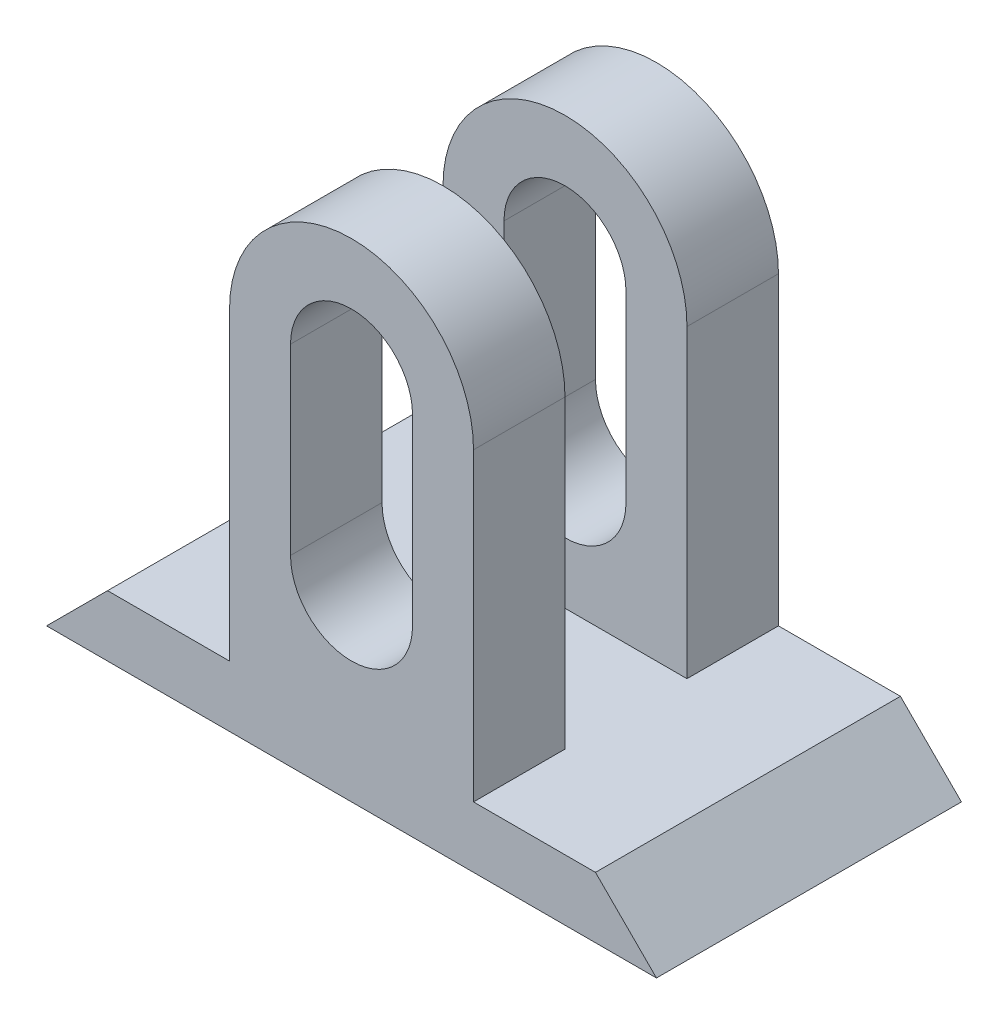
ISO-10303-21;
HEADER;
FILE_DESCRIPTION(('STEP AP214'),'2;1');
FILE_NAME('part.step','',(''),(''),'','','');
FILE_SCHEMA(('AUTOMOTIVE_DESIGN { 1 0 10303 214 1 1 1 1 }'));
ENDSEC;
DATA;
#1=APPLICATION_CONTEXT('core data for automotive mechanical design processes');
#2=APPLICATION_PROTOCOL_DEFINITION('international standard','automotive_design',2000,#1);
#3=PRODUCT_CONTEXT('',#1,'mechanical');
#4=PRODUCT('Part','Part','',(#3));
#5=PRODUCT_RELATED_PRODUCT_CATEGORY('part','',(#4));
#6=PRODUCT_DEFINITION_FORMATION('','',#4);
#7=PRODUCT_DEFINITION_CONTEXT('part definition',#1,'design');
#8=PRODUCT_DEFINITION('design','',#6,#7);
#9=PRODUCT_DEFINITION_SHAPE('','',#8);
#10=(LENGTH_UNIT() NAMED_UNIT(*) SI_UNIT(.MILLI.,.METRE.));
#11=(NAMED_UNIT(*) PLANE_ANGLE_UNIT() SI_UNIT($,.RADIAN.));
#12=(NAMED_UNIT(*) SI_UNIT($,.STERADIAN.) SOLID_ANGLE_UNIT());
#13=UNCERTAINTY_MEASURE_WITH_UNIT(LENGTH_MEASURE(1.E-05),#10,'distance_accuracy_value','');
#14=(GEOMETRIC_REPRESENTATION_CONTEXT(3) GLOBAL_UNCERTAINTY_ASSIGNED_CONTEXT((#13)) GLOBAL_UNIT_ASSIGNED_CONTEXT((#10,
#11,#12)) REPRESENTATION_CONTEXT('',''));
#15=CARTESIAN_POINT('',(0.,0.,0.));
#16=DIRECTION('',(0.,0.,1.));
#17=DIRECTION('',(1.,0.,0.));
#18=AXIS2_PLACEMENT_3D('',#15,#16,#17);
#19=CARTESIAN_POINT('',(0.,9.99999999999999,50.));
#20=DIRECTION('',(0.,1.,0.));
#21=DIRECTION('',(-1.,0.,0.));
#22=AXIS2_PLACEMENT_3D('',#19,#20,#21);
#23=PLANE('',#22);
#24=DIRECTION('',(1.,0.,0.));
#25=VECTOR('',#24,1.);
#26=CARTESIAN_POINT('',(0.,9.99999999999999,50.));
#27=LINE('',#26,#25);
#28=CARTESIAN_POINT('',(10.,10.,50.));
#29=VERTEX_POINT('',#28);
#30=CARTESIAN_POINT('',(30.,10.,50.));
#31=VERTEX_POINT('',#30);
#32=EDGE_CURVE('E324',#29,#31,#27,.T.);
#33=ORIENTED_EDGE('',*,*,#32,.T.);
#34=DIRECTION('',(0.,0.,1.));
#35=VECTOR('',#34,1.);
#36=CARTESIAN_POINT('',(30.,10.,35.));
#37=LINE('',#36,#35);
#38=CARTESIAN_POINT('',(30.,10.,35.));
#39=VERTEX_POINT('',#38);
#40=EDGE_CURVE('E82',#39,#31,#37,.T.);
#41=ORIENTED_EDGE('',*,*,#40,.F.);
#42=DIRECTION('',(-1.,0.,0.));
#43=VECTOR('',#42,1.);
#44=CARTESIAN_POINT('',(0.,9.99999999999999,35.));
#45=LINE('',#44,#43);
#46=CARTESIAN_POINT('',(70.,10.,35.));
#47=VERTEX_POINT('',#46);
#48=EDGE_CURVE('E77',#47,#39,#45,.T.);
#49=ORIENTED_EDGE('',*,*,#48,.F.);
#50=DIRECTION('',(0.,0.,1.));
#51=VECTOR('',#50,1.);
#52=CARTESIAN_POINT('',(70.,10.,35.));
#53=LINE('',#52,#51);
#54=CARTESIAN_POINT('',(70.,10.,50.));
#55=VERTEX_POINT('',#54);
#56=EDGE_CURVE('E251',#47,#55,#53,.T.);
#57=ORIENTED_EDGE('',*,*,#56,.T.);
#58=CARTESIAN_POINT('',(90.,9.99999999999999,50.));
#59=VERTEX_POINT('',#58);
#60=EDGE_CURVE('E327',#55,#59,#27,.T.);
#61=ORIENTED_EDGE('',*,*,#60,.T.);
#62=DIRECTION('',(0.,0.,-1.));
#63=VECTOR('',#62,1.);
#64=CARTESIAN_POINT('',(90.,9.99999999999999,50.));
#65=LINE('',#64,#63);
#66=CARTESIAN_POINT('',(90.,9.99999999999999,0.));
#67=VERTEX_POINT('',#66);
#68=EDGE_CURVE('E334',#59,#67,#65,.T.);
#69=ORIENTED_EDGE('',*,*,#68,.T.);
#70=DIRECTION('',(1.,0.,0.));
#71=VECTOR('',#70,1.);
#72=CARTESIAN_POINT('',(0.,9.99999999999999,0.));
#73=LINE('',#72,#71);
#74=CARTESIAN_POINT('',(70.,10.,0.));
#75=VERTEX_POINT('',#74);
#76=EDGE_CURVE('E317',#75,#67,#73,.T.);
#77=ORIENTED_EDGE('',*,*,#76,.F.);
#78=DIRECTION('',(0.,0.,-1.));
#79=VECTOR('',#78,1.);
#80=CARTESIAN_POINT('',(70.,10.,15.));
#81=LINE('',#80,#79);
#82=CARTESIAN_POINT('',(70.,10.,15.));
#83=VERTEX_POINT('',#82);
#84=EDGE_CURVE('E305',#83,#75,#81,.T.);
#85=ORIENTED_EDGE('',*,*,#84,.F.);
#86=DIRECTION('',(1.,0.,0.));
#87=VECTOR('',#86,1.);
#88=CARTESIAN_POINT('',(0.,9.99999999999999,15.));
#89=LINE('',#88,#87);
#90=CARTESIAN_POINT('',(30.,10.,15.));
#91=VERTEX_POINT('',#90);
#92=EDGE_CURVE('E285',#91,#83,#89,.T.);
#93=ORIENTED_EDGE('',*,*,#92,.F.);
#94=DIRECTION('',(0.,0.,-1.));
#95=VECTOR('',#94,1.);
#96=CARTESIAN_POINT('',(30.,10.,15.));
#97=LINE('',#96,#95);
#98=CARTESIAN_POINT('',(30.,10.,0.));
#99=VERTEX_POINT('',#98);
#100=EDGE_CURVE('E307',#91,#99,#97,.T.);
#101=ORIENTED_EDGE('',*,*,#100,.T.);
#102=CARTESIAN_POINT('',(10.,10.,0.));
#103=VERTEX_POINT('',#102);
#104=EDGE_CURVE('E335',#103,#99,#73,.T.);
#105=ORIENTED_EDGE('',*,*,#104,.F.);
#106=DIRECTION('',(0.,0.,-1.));
#107=VECTOR('',#106,1.);
#108=CARTESIAN_POINT('',(10.,10.,50.));
#109=LINE('',#108,#107);
#110=EDGE_CURVE('E12',#29,#103,#109,.T.);
#111=ORIENTED_EDGE('',*,*,#110,.F.);
#112=EDGE_LOOP('',(#33,#41,#49,#57,#61,#69,#77,#85,#93,#101,#105,#111));
#113=FACE_BOUND('',#112,.T.);
#114=ADVANCED_FACE('F63',(#113),#23,.T.);
#115=CARTESIAN_POINT('',(0.,0.,50.));
#116=DIRECTION('',(0.707106781186548,-0.707106781186548,0.));
#117=DIRECTION('',(0.707106781186548,0.707106781186548,0.));
#118=AXIS2_PLACEMENT_3D('',#115,#116,#117);
#119=PLANE('',#118);
#120=DIRECTION('',(-0.707106781186548,-0.707106781186548,0.));
#121=VECTOR('',#120,1.);
#122=CARTESIAN_POINT('',(0.,0.,0.));
#123=LINE('',#122,#121);
#124=CARTESIAN_POINT('',(0.,0.,0.));
#125=VERTEX_POINT('',#124);
#126=EDGE_CURVE('E338',#103,#125,#123,.T.);
#127=ORIENTED_EDGE('',*,*,#126,.T.);
#128=DIRECTION('',(0.,0.,-1.));
#129=VECTOR('',#128,1.);
#130=CARTESIAN_POINT('',(0.,0.,50.));
#131=LINE('',#130,#129);
#132=CARTESIAN_POINT('',(0.,0.,50.));
#133=VERTEX_POINT('',#132);
#134=EDGE_CURVE('E70',#133,#125,#131,.T.);
#135=ORIENTED_EDGE('',*,*,#134,.F.);
#136=DIRECTION('',(-0.707106781186548,-0.707106781186548,0.));
#137=VECTOR('',#136,1.);
#138=CARTESIAN_POINT('',(0.,0.,50.));
#139=LINE('',#138,#137);
#140=EDGE_CURVE('E326',#29,#133,#139,.T.);
#141=ORIENTED_EDGE('',*,*,#140,.F.);
#142=ORIENTED_EDGE('',*,*,#110,.T.);
#143=EDGE_LOOP('',(#127,#135,#141,#142));
#144=FACE_BOUND('',#143,.T.);
#145=ADVANCED_FACE('F376',(#144),#119,.F.);
#146=CARTESIAN_POINT('',(0.,0.,50.));
#147=DIRECTION('',(0.,1.,0.));
#148=DIRECTION('',(0.,0.,1.));
#149=AXIS2_PLACEMENT_3D('',#146,#147,#148);
#150=PLANE('',#149);
#151=DIRECTION('',(1.,0.,0.));
#152=VECTOR('',#151,1.);
#153=CARTESIAN_POINT('',(0.,0.,0.));
#154=LINE('',#153,#152);
#155=CARTESIAN_POINT('',(100.,0.,0.));
#156=VERTEX_POINT('',#155);
#157=EDGE_CURVE('E340',#125,#156,#154,.T.);
#158=ORIENTED_EDGE('',*,*,#157,.T.);
#159=DIRECTION('',(0.,0.,-1.));
#160=VECTOR('',#159,1.);
#161=CARTESIAN_POINT('',(100.,0.,50.));
#162=LINE('',#161,#160);
#163=CARTESIAN_POINT('',(100.,0.,50.));
#164=VERTEX_POINT('',#163);
#165=EDGE_CURVE('E347',#164,#156,#162,.T.);
#166=ORIENTED_EDGE('',*,*,#165,.F.);
#167=DIRECTION('',(1.,0.,0.));
#168=VECTOR('',#167,1.);
#169=CARTESIAN_POINT('',(0.,0.,50.));
#170=LINE('',#169,#168);
#171=EDGE_CURVE('E329',#133,#164,#170,.T.);
#172=ORIENTED_EDGE('',*,*,#171,.F.);
#173=ORIENTED_EDGE('',*,*,#134,.T.);
#174=EDGE_LOOP('',(#158,#166,#172,#173));
#175=FACE_BOUND('',#174,.T.);
#176=ADVANCED_FACE('F354',(#175),#150,.F.);
#177=CARTESIAN_POINT('',(50.,50.,50.));
#178=DIRECTION('',(-0.707106781186548,-0.707106781186547,0.));
#179=DIRECTION('',(0.707106781186547,-0.707106781186548,0.));
#180=AXIS2_PLACEMENT_3D('',#177,#178,#179);
#181=PLANE('',#180);
#182=DIRECTION('',(-0.707106781186547,0.707106781186548,0.));
#183=VECTOR('',#182,1.);
#184=CARTESIAN_POINT('',(50.,50.,0.));
#185=LINE('',#184,#183);
#186=EDGE_CURVE('E342',#156,#67,#185,.T.);
#187=ORIENTED_EDGE('',*,*,#186,.T.);
#188=ORIENTED_EDGE('',*,*,#68,.F.);
#189=DIRECTION('',(-0.707106781186547,0.707106781186548,0.));
#190=VECTOR('',#189,1.);
#191=CARTESIAN_POINT('',(50.,50.,50.));
#192=LINE('',#191,#190);
#193=EDGE_CURVE('E331',#164,#59,#192,.T.);
#194=ORIENTED_EDGE('',*,*,#193,.F.);
#195=ORIENTED_EDGE('',*,*,#165,.T.);
#196=EDGE_LOOP('',(#187,#188,#194,#195));
#197=FACE_BOUND('',#196,.T.);
#198=ADVANCED_FACE('F368',(#197),#181,.F.);
#199=CARTESIAN_POINT('',(0.,0.,50.));
#200=DIRECTION('',(0.,0.,1.));
#201=DIRECTION('',(1.,0.,0.));
#202=AXIS2_PLACEMENT_3D('',#199,#200,#201);
#203=PLANE('',#202);
#204=ORIENTED_EDGE('',*,*,#32,.F.);
#205=ORIENTED_EDGE('',*,*,#140,.T.);
#206=ORIENTED_EDGE('',*,*,#171,.T.);
#207=ORIENTED_EDGE('',*,*,#193,.T.);
#208=ORIENTED_EDGE('',*,*,#60,.F.);
#209=DIRECTION('',(0.,-1.,0.));
#210=VECTOR('',#209,1.);
#211=CARTESIAN_POINT('',(70.,0.,50.));
#212=LINE('',#211,#210);
#213=CARTESIAN_POINT('',(70.,60.,50.));
#214=VERTEX_POINT('',#213);
#215=EDGE_CURVE('E244',#214,#55,#212,.T.);
#216=ORIENTED_EDGE('',*,*,#215,.F.);
#217=CARTESIAN_POINT('',(50.,60.,50.));
#218=DIRECTION('',(0.,0.,1.));
#219=DIRECTION('',(1.,0.,0.));
#220=AXIS2_PLACEMENT_3D('',#217,#218,#219);
#221=CIRCLE('',#220,20.);
#222=CARTESIAN_POINT('',(30.,60.,50.));
#223=VERTEX_POINT('',#222);
#224=EDGE_CURVE('E254',#214,#223,#221,.T.);
#225=ORIENTED_EDGE('',*,*,#224,.T.);
#226=DIRECTION('',(0.,1.,0.));
#227=VECTOR('',#226,1.);
#228=CARTESIAN_POINT('',(30.,0.,50.));
#229=LINE('',#228,#227);
#230=EDGE_CURVE('E238',#31,#223,#229,.T.);
#231=ORIENTED_EDGE('',*,*,#230,.F.);
#232=EDGE_LOOP('',(#204,#205,#206,#207,#208,#216,#225,#231));
#233=FACE_BOUND('',#232,.T.);
#234=CARTESIAN_POINT('',(50.,60.,50.));
#235=DIRECTION('',(0.,0.,1.));
#236=DIRECTION('',(1.,0.,0.));
#237=AXIS2_PLACEMENT_3D('',#234,#235,#236);
#238=CIRCLE('',#237,10.);
#239=CARTESIAN_POINT('',(60.,60.,50.));
#240=VERTEX_POINT('',#239);
#241=CARTESIAN_POINT('',(40.,60.,50.));
#242=VERTEX_POINT('',#241);
#243=EDGE_CURVE('E217',#240,#242,#238,.T.);
#244=ORIENTED_EDGE('',*,*,#243,.F.);
#245=DIRECTION('',(0.,1.,0.));
#246=VECTOR('',#245,1.);
#247=CARTESIAN_POINT('',(60.,0.,50.));
#248=LINE('',#247,#246);
#249=CARTESIAN_POINT('',(60.,30.,50.));
#250=VERTEX_POINT('',#249);
#251=EDGE_CURVE('E223',#250,#240,#248,.T.);
#252=ORIENTED_EDGE('',*,*,#251,.F.);
#253=CARTESIAN_POINT('',(50.,30.,50.));
#254=DIRECTION('',(0.,0.,1.));
#255=DIRECTION('',(1.,0.,0.));
#256=AXIS2_PLACEMENT_3D('',#253,#254,#255);
#257=CIRCLE('',#256,10.);
#258=CARTESIAN_POINT('',(40.,30.,50.));
#259=VERTEX_POINT('',#258);
#260=EDGE_CURVE('E226',#259,#250,#257,.T.);
#261=ORIENTED_EDGE('',*,*,#260,.F.);
#262=DIRECTION('',(0.,1.,0.));
#263=VECTOR('',#262,1.);
#264=CARTESIAN_POINT('',(40.,0.,50.));
#265=LINE('',#264,#263);
#266=EDGE_CURVE('E232',#259,#242,#265,.T.);
#267=ORIENTED_EDGE('',*,*,#266,.T.);
#268=EDGE_LOOP('',(#244,#252,#261,#267));
#269=FACE_BOUND('',#268,.T.);
#270=ADVANCED_FACE('F372',(#233,#269),#203,.T.);
#271=CARTESIAN_POINT('',(0.,0.,0.));
#272=DIRECTION('',(0.,0.,1.));
#273=DIRECTION('',(1.,0.,0.));
#274=AXIS2_PLACEMENT_3D('',#271,#272,#273);
#275=PLANE('',#274);
#276=ORIENTED_EDGE('',*,*,#104,.T.);
#277=DIRECTION('',(0.,-1.,0.));
#278=VECTOR('',#277,1.);
#279=CARTESIAN_POINT('',(30.,0.,0.));
#280=LINE('',#279,#278);
#281=CARTESIAN_POINT('',(30.,60.,0.));
#282=VERTEX_POINT('',#281);
#283=EDGE_CURVE('E270',#282,#99,#280,.T.);
#284=ORIENTED_EDGE('',*,*,#283,.F.);
#285=CARTESIAN_POINT('',(50.,60.,0.));
#286=DIRECTION('',(0.,0.,1.));
#287=DIRECTION('',(1.,0.,0.));
#288=AXIS2_PLACEMENT_3D('',#285,#286,#287);
#289=CIRCLE('',#288,20.);
#290=CARTESIAN_POINT('',(70.,60.,0.));
#291=VERTEX_POINT('',#290);
#292=EDGE_CURVE('E302',#291,#282,#289,.T.);
#293=ORIENTED_EDGE('',*,*,#292,.F.);
#294=DIRECTION('',(0.,1.,0.));
#295=VECTOR('',#294,1.);
#296=CARTESIAN_POINT('',(70.,0.,0.));
#297=LINE('',#296,#295);
#298=EDGE_CURVE('E299',#75,#291,#297,.T.);
#299=ORIENTED_EDGE('',*,*,#298,.F.);
#300=ORIENTED_EDGE('',*,*,#76,.T.);
#301=ORIENTED_EDGE('',*,*,#186,.F.);
#302=ORIENTED_EDGE('',*,*,#157,.F.);
#303=ORIENTED_EDGE('',*,*,#126,.F.);
#304=EDGE_LOOP('',(#276,#284,#293,#299,#300,#301,#302,#303));
#305=FACE_BOUND('',#304,.T.);
#306=CARTESIAN_POINT('',(50.,30.,0.));
#307=DIRECTION('',(0.,0.,1.));
#308=DIRECTION('',(1.,0.,0.));
#309=AXIS2_PLACEMENT_3D('',#306,#307,#308);
#310=CIRCLE('',#309,10.);
#311=CARTESIAN_POINT('',(40.,30.,0.));
#312=VERTEX_POINT('',#311);
#313=CARTESIAN_POINT('',(60.,30.,0.));
#314=VERTEX_POINT('',#313);
#315=EDGE_CURVE('E265',#312,#314,#310,.T.);
#316=ORIENTED_EDGE('',*,*,#315,.T.);
#317=DIRECTION('',(0.,-1.,0.));
#318=VECTOR('',#317,1.);
#319=CARTESIAN_POINT('',(60.,0.,0.));
#320=LINE('',#319,#318);
#321=CARTESIAN_POINT('',(60.,60.,0.));
#322=VERTEX_POINT('',#321);
#323=EDGE_CURVE('E296',#322,#314,#320,.T.);
#324=ORIENTED_EDGE('',*,*,#323,.F.);
#325=CARTESIAN_POINT('',(50.,60.,0.));
#326=DIRECTION('',(0.,0.,1.));
#327=DIRECTION('',(1.,0.,0.));
#328=AXIS2_PLACEMENT_3D('',#325,#326,#327);
#329=CIRCLE('',#328,10.);
#330=CARTESIAN_POINT('',(40.,60.,0.));
#331=VERTEX_POINT('',#330);
#332=EDGE_CURVE('E293',#322,#331,#329,.T.);
#333=ORIENTED_EDGE('',*,*,#332,.T.);
#334=DIRECTION('',(0.,-1.,0.));
#335=VECTOR('',#334,1.);
#336=CARTESIAN_POINT('',(40.,0.,0.));
#337=LINE('',#336,#335);
#338=EDGE_CURVE('E290',#331,#312,#337,.T.);
#339=ORIENTED_EDGE('',*,*,#338,.T.);
#340=EDGE_LOOP('',(#316,#324,#333,#339));
#341=FACE_BOUND('',#340,.T.);
#342=ADVANCED_FACE('F361',(#305,#341),#275,.F.);
#343=CARTESIAN_POINT('',(70.,0.,15.));
#344=DIRECTION('',(-1.,0.,0.));
#345=DIRECTION('',(0.,-1.,0.));
#346=AXIS2_PLACEMENT_3D('',#343,#344,#345);
#347=PLANE('',#346);
#348=ORIENTED_EDGE('',*,*,#298,.T.);
#349=DIRECTION('',(0.,0.,-1.));
#350=VECTOR('',#349,1.);
#351=CARTESIAN_POINT('',(70.,60.,15.));
#352=LINE('',#351,#350);
#353=CARTESIAN_POINT('',(70.,60.,15.));
#354=VERTEX_POINT('',#353);
#355=EDGE_CURVE('E314',#354,#291,#352,.T.);
#356=ORIENTED_EDGE('',*,*,#355,.F.);
#357=DIRECTION('',(0.,1.,0.));
#358=VECTOR('',#357,1.);
#359=CARTESIAN_POINT('',(70.,0.,15.));
#360=LINE('',#359,#358);
#361=EDGE_CURVE('E278',#83,#354,#360,.T.);
#362=ORIENTED_EDGE('',*,*,#361,.F.);
#363=ORIENTED_EDGE('',*,*,#84,.T.);
#364=EDGE_LOOP('',(#348,#356,#362,#363));
#365=FACE_BOUND('',#364,.T.);
#366=ADVANCED_FACE('F389',(#365),#347,.F.);
#367=CARTESIAN_POINT('',(50.,60.,15.));
#368=DIRECTION('',(0.,0.,-1.));
#369=DIRECTION('',(-1.,0.,0.));
#370=AXIS2_PLACEMENT_3D('',#367,#368,#369);
#371=CYLINDRICAL_SURFACE('',#370,20.);
#372=ORIENTED_EDGE('',*,*,#292,.T.);
#373=DIRECTION('',(0.,0.,-1.));
#374=VECTOR('',#373,1.);
#375=CARTESIAN_POINT('',(30.,60.,15.));
#376=LINE('',#375,#374);
#377=CARTESIAN_POINT('',(30.,60.,15.));
#378=VERTEX_POINT('',#377);
#379=EDGE_CURVE('E311',#378,#282,#376,.T.);
#380=ORIENTED_EDGE('',*,*,#379,.F.);
#381=CARTESIAN_POINT('',(50.,60.,15.));
#382=DIRECTION('',(0.,0.,1.));
#383=DIRECTION('',(1.,0.,0.));
#384=AXIS2_PLACEMENT_3D('',#381,#382,#383);
#385=CIRCLE('',#384,20.);
#386=EDGE_CURVE('E281',#354,#378,#385,.T.);
#387=ORIENTED_EDGE('',*,*,#386,.F.);
#388=ORIENTED_EDGE('',*,*,#355,.T.);
#389=EDGE_LOOP('',(#372,#380,#387,#388));
#390=FACE_BOUND('',#389,.T.);
#391=ADVANCED_FACE('F385',(#390),#371,.T.);
#392=CARTESIAN_POINT('',(30.,0.,15.));
#393=DIRECTION('',(1.,0.,0.));
#394=DIRECTION('',(0.,1.,0.));
#395=AXIS2_PLACEMENT_3D('',#392,#393,#394);
#396=PLANE('',#395);
#397=ORIENTED_EDGE('',*,*,#283,.T.);
#398=ORIENTED_EDGE('',*,*,#100,.F.);
#399=DIRECTION('',(0.,-1.,0.));
#400=VECTOR('',#399,1.);
#401=CARTESIAN_POINT('',(30.,0.,15.));
#402=LINE('',#401,#400);
#403=EDGE_CURVE('E283',#378,#91,#402,.T.);
#404=ORIENTED_EDGE('',*,*,#403,.F.);
#405=ORIENTED_EDGE('',*,*,#379,.T.);
#406=EDGE_LOOP('',(#397,#398,#404,#405));
#407=FACE_BOUND('',#406,.T.);
#408=ADVANCED_FACE('F381',(#407),#396,.F.);
#409=CARTESIAN_POINT('',(50.,30.,15.));
#410=DIRECTION('',(0.,0.,-1.));
#411=DIRECTION('',(-1.,0.,0.));
#412=AXIS2_PLACEMENT_3D('',#409,#410,#411);
#413=CYLINDRICAL_SURFACE('',#412,10.);
#414=ORIENTED_EDGE('',*,*,#315,.F.);
#415=DIRECTION('',(0.,0.,-1.));
#416=VECTOR('',#415,1.);
#417=CARTESIAN_POINT('',(40.,30.,15.));
#418=LINE('',#417,#416);
#419=CARTESIAN_POINT('',(40.,30.,15.));
#420=VERTEX_POINT('',#419);
#421=EDGE_CURVE('E308',#420,#312,#418,.T.);
#422=ORIENTED_EDGE('',*,*,#421,.F.);
#423=CARTESIAN_POINT('',(50.,30.,15.));
#424=DIRECTION('',(0.,0.,1.));
#425=DIRECTION('',(1.,0.,0.));
#426=AXIS2_PLACEMENT_3D('',#423,#424,#425);
#427=CIRCLE('',#426,10.);
#428=CARTESIAN_POINT('',(60.,30.,15.));
#429=VERTEX_POINT('',#428);
#430=EDGE_CURVE('E266',#420,#429,#427,.T.);
#431=ORIENTED_EDGE('',*,*,#430,.T.);
#432=DIRECTION('',(0.,0.,-1.));
#433=VECTOR('',#432,1.);
#434=CARTESIAN_POINT('',(60.,30.,15.));
#435=LINE('',#434,#433);
#436=EDGE_CURVE('E287',#429,#314,#435,.T.);
#437=ORIENTED_EDGE('',*,*,#436,.T.);
#438=EDGE_LOOP('',(#414,#422,#431,#437));
#439=FACE_BOUND('',#438,.T.);
#440=ADVANCED_FACE('F426',(#439),#413,.F.);
#441=CARTESIAN_POINT('',(40.,0.,15.));
#442=DIRECTION('',(1.,0.,0.));
#443=DIRECTION('',(0.,0.,-1.));
#444=AXIS2_PLACEMENT_3D('',#441,#442,#443);
#445=PLANE('',#444);
#446=ORIENTED_EDGE('',*,*,#338,.F.);
#447=DIRECTION('',(0.,0.,-1.));
#448=VECTOR('',#447,1.);
#449=CARTESIAN_POINT('',(40.,60.,15.));
#450=LINE('',#449,#448);
#451=CARTESIAN_POINT('',(40.,60.,15.));
#452=VERTEX_POINT('',#451);
#453=EDGE_CURVE('E321',#452,#331,#450,.T.);
#454=ORIENTED_EDGE('',*,*,#453,.F.);
#455=DIRECTION('',(0.,-1.,0.));
#456=VECTOR('',#455,1.);
#457=CARTESIAN_POINT('',(40.,0.,15.));
#458=LINE('',#457,#456);
#459=EDGE_CURVE('E269',#452,#420,#458,.T.);
#460=ORIENTED_EDGE('',*,*,#459,.T.);
#461=ORIENTED_EDGE('',*,*,#421,.T.);
#462=EDGE_LOOP('',(#446,#454,#460,#461));
#463=FACE_BOUND('',#462,.T.);
#464=ADVANCED_FACE('F429',(#463),#445,.T.);
#465=CARTESIAN_POINT('',(50.,60.,15.));
#466=DIRECTION('',(0.,0.,-1.));
#467=DIRECTION('',(-1.,0.,0.));
#468=AXIS2_PLACEMENT_3D('',#465,#466,#467);
#469=CYLINDRICAL_SURFACE('',#468,10.);
#470=ORIENTED_EDGE('',*,*,#332,.F.);
#471=DIRECTION('',(0.,0.,-1.));
#472=VECTOR('',#471,1.);
#473=CARTESIAN_POINT('',(60.,60.,15.));
#474=LINE('',#473,#472);
#475=CARTESIAN_POINT('',(60.,60.,15.));
#476=VERTEX_POINT('',#475);
#477=EDGE_CURVE('E319',#476,#322,#474,.T.);
#478=ORIENTED_EDGE('',*,*,#477,.F.);
#479=CARTESIAN_POINT('',(50.,60.,15.));
#480=DIRECTION('',(0.,0.,1.));
#481=DIRECTION('',(1.,0.,0.));
#482=AXIS2_PLACEMENT_3D('',#479,#480,#481);
#483=CIRCLE('',#482,10.);
#484=EDGE_CURVE('E273',#476,#452,#483,.T.);
#485=ORIENTED_EDGE('',*,*,#484,.T.);
#486=ORIENTED_EDGE('',*,*,#453,.T.);
#487=EDGE_LOOP('',(#470,#478,#485,#486));
#488=FACE_BOUND('',#487,.T.);
#489=ADVANCED_FACE('F433',(#488),#469,.F.);
#490=CARTESIAN_POINT('',(60.,0.,15.));
#491=DIRECTION('',(1.,0.,0.));
#492=DIRECTION('',(0.,1.,0.));
#493=AXIS2_PLACEMENT_3D('',#490,#491,#492);
#494=PLANE('',#493);
#495=ORIENTED_EDGE('',*,*,#323,.T.);
#496=ORIENTED_EDGE('',*,*,#436,.F.);
#497=DIRECTION('',(0.,-1.,0.));
#498=VECTOR('',#497,1.);
#499=CARTESIAN_POINT('',(60.,0.,15.));
#500=LINE('',#499,#498);
#501=EDGE_CURVE('E276',#476,#429,#500,.T.);
#502=ORIENTED_EDGE('',*,*,#501,.F.);
#503=ORIENTED_EDGE('',*,*,#477,.T.);
#504=EDGE_LOOP('',(#495,#496,#502,#503));
#505=FACE_BOUND('',#504,.T.);
#506=ADVANCED_FACE('F437',(#505),#494,.F.);
#507=CARTESIAN_POINT('',(0.,0.,15.));
#508=DIRECTION('',(0.,0.,1.));
#509=DIRECTION('',(1.,0.,0.));
#510=AXIS2_PLACEMENT_3D('',#507,#508,#509);
#511=PLANE('',#510);
#512=ORIENTED_EDGE('',*,*,#430,.F.);
#513=ORIENTED_EDGE('',*,*,#459,.F.);
#514=ORIENTED_EDGE('',*,*,#484,.F.);
#515=ORIENTED_EDGE('',*,*,#501,.T.);
#516=EDGE_LOOP('',(#512,#513,#514,#515));
#517=FACE_BOUND('',#516,.T.);
#518=ORIENTED_EDGE('',*,*,#361,.T.);
#519=ORIENTED_EDGE('',*,*,#386,.T.);
#520=ORIENTED_EDGE('',*,*,#403,.T.);
#521=ORIENTED_EDGE('',*,*,#92,.T.);
#522=EDGE_LOOP('',(#518,#519,#520,#521));
#523=FACE_BOUND('',#522,.T.);
#524=ADVANCED_FACE('F441',(#517,#523),#511,.T.);
#525=CARTESIAN_POINT('',(30.,0.,35.));
#526=DIRECTION('',(1.,0.,0.));
#527=DIRECTION('',(0.,1.,0.));
#528=AXIS2_PLACEMENT_3D('',#525,#526,#527);
#529=PLANE('',#528);
#530=ORIENTED_EDGE('',*,*,#230,.T.);
#531=DIRECTION('',(0.,0.,1.));
#532=VECTOR('',#531,1.);
#533=CARTESIAN_POINT('',(30.,60.,35.));
#534=LINE('',#533,#532);
#535=CARTESIAN_POINT('',(30.,60.,35.));
#536=VERTEX_POINT('',#535);
#537=EDGE_CURVE('E262',#536,#223,#534,.T.);
#538=ORIENTED_EDGE('',*,*,#537,.F.);
#539=DIRECTION('',(0.,1.,0.));
#540=VECTOR('',#539,1.);
#541=CARTESIAN_POINT('',(30.,0.,35.));
#542=LINE('',#541,#540);
#543=EDGE_CURVE('E243',#39,#536,#542,.T.);
#544=ORIENTED_EDGE('',*,*,#543,.F.);
#545=ORIENTED_EDGE('',*,*,#40,.T.);
#546=EDGE_LOOP('',(#530,#538,#544,#545));
#547=FACE_BOUND('',#546,.T.);
#548=ADVANCED_FACE('F401',(#547),#529,.F.);
#549=CARTESIAN_POINT('',(50.,60.,35.));
#550=DIRECTION('',(0.,0.,1.));
#551=DIRECTION('',(1.,0.,0.));
#552=AXIS2_PLACEMENT_3D('',#549,#550,#551);
#553=CYLINDRICAL_SURFACE('',#552,20.);
#554=ORIENTED_EDGE('',*,*,#224,.F.);
#555=DIRECTION('',(0.,0.,1.));
#556=VECTOR('',#555,1.);
#557=CARTESIAN_POINT('',(70.,60.,35.));
#558=LINE('',#557,#556);
#559=CARTESIAN_POINT('',(70.,60.,35.));
#560=VERTEX_POINT('',#559);
#561=EDGE_CURVE('E260',#560,#214,#558,.T.);
#562=ORIENTED_EDGE('',*,*,#561,.F.);
#563=CARTESIAN_POINT('',(50.,60.,35.));
#564=DIRECTION('',(0.,0.,1.));
#565=DIRECTION('',(1.,0.,0.));
#566=AXIS2_PLACEMENT_3D('',#563,#564,#565);
#567=CIRCLE('',#566,20.);
#568=EDGE_CURVE('E246',#560,#536,#567,.T.);
#569=ORIENTED_EDGE('',*,*,#568,.T.);
#570=ORIENTED_EDGE('',*,*,#537,.T.);
#571=EDGE_LOOP('',(#554,#562,#569,#570));
#572=FACE_BOUND('',#571,.T.);
#573=ADVANCED_FACE('F397',(#572),#553,.T.);
#574=CARTESIAN_POINT('',(70.,0.,35.));
#575=DIRECTION('',(-1.,0.,0.));
#576=DIRECTION('',(0.,-1.,0.));
#577=AXIS2_PLACEMENT_3D('',#574,#575,#576);
#578=PLANE('',#577);
#579=ORIENTED_EDGE('',*,*,#215,.T.);
#580=ORIENTED_EDGE('',*,*,#56,.F.);
#581=DIRECTION('',(0.,-1.,0.));
#582=VECTOR('',#581,1.);
#583=CARTESIAN_POINT('',(70.,0.,35.));
#584=LINE('',#583,#582);
#585=EDGE_CURVE('E249',#560,#47,#584,.T.);
#586=ORIENTED_EDGE('',*,*,#585,.F.);
#587=ORIENTED_EDGE('',*,*,#561,.T.);
#588=EDGE_LOOP('',(#579,#580,#586,#587));
#589=FACE_BOUND('',#588,.T.);
#590=ADVANCED_FACE('F394',(#589),#578,.F.);
#591=CARTESIAN_POINT('',(50.,60.,35.));
#592=DIRECTION('',(0.,0.,1.));
#593=DIRECTION('',(1.,0.,0.));
#594=AXIS2_PLACEMENT_3D('',#591,#592,#593);
#595=PLANE('',#594);
#596=DIRECTION('',(0.,1.,0.));
#597=VECTOR('',#596,1.);
#598=CARTESIAN_POINT('',(60.,0.,35.));
#599=LINE('',#598,#597);
#600=CARTESIAN_POINT('',(60.,30.,35.));
#601=VERTEX_POINT('',#600);
#602=CARTESIAN_POINT('',(60.,60.,35.));
#603=VERTEX_POINT('',#602);
#604=EDGE_CURVE('E218',#601,#603,#599,.T.);
#605=ORIENTED_EDGE('',*,*,#604,.T.);
#606=CARTESIAN_POINT('',(50.,60.,35.));
#607=DIRECTION('',(0.,0.,1.));
#608=DIRECTION('',(1.,0.,0.));
#609=AXIS2_PLACEMENT_3D('',#606,#607,#608);
#610=CIRCLE('',#609,10.);
#611=CARTESIAN_POINT('',(40.,60.,35.));
#612=VERTEX_POINT('',#611);
#613=EDGE_CURVE('E210',#603,#612,#610,.T.);
#614=ORIENTED_EDGE('',*,*,#613,.T.);
#615=DIRECTION('',(0.,1.,0.));
#616=VECTOR('',#615,1.);
#617=CARTESIAN_POINT('',(40.,0.,35.));
#618=LINE('',#617,#616);
#619=CARTESIAN_POINT('',(40.,30.,35.));
#620=VERTEX_POINT('',#619);
#621=EDGE_CURVE('E199',#620,#612,#618,.T.);
#622=ORIENTED_EDGE('',*,*,#621,.F.);
#623=CARTESIAN_POINT('',(50.,30.,35.));
#624=DIRECTION('',(0.,0.,1.));
#625=DIRECTION('',(1.,0.,0.));
#626=AXIS2_PLACEMENT_3D('',#623,#624,#625);
#627=CIRCLE('',#626,10.);
#628=EDGE_CURVE('E209',#620,#601,#627,.T.);
#629=ORIENTED_EDGE('',*,*,#628,.T.);
#630=EDGE_LOOP('',(#605,#614,#622,#629));
#631=FACE_BOUND('',#630,.T.);
#632=ORIENTED_EDGE('',*,*,#48,.T.);
#633=ORIENTED_EDGE('',*,*,#543,.T.);
#634=ORIENTED_EDGE('',*,*,#568,.F.);
#635=ORIENTED_EDGE('',*,*,#585,.T.);
#636=EDGE_LOOP('',(#632,#633,#634,#635));
#637=FACE_BOUND('',#636,.T.);
#638=ADVANCED_FACE('F220',(#631,#637),#595,.F.);
#639=CARTESIAN_POINT('',(50.,60.,35.));
#640=DIRECTION('',(0.,0.,1.));
#641=DIRECTION('',(1.,0.,0.));
#642=AXIS2_PLACEMENT_3D('',#639,#640,#641);
#643=CYLINDRICAL_SURFACE('',#642,10.);
#644=ORIENTED_EDGE('',*,*,#243,.T.);
#645=DIRECTION('',(0.,0.,1.));
#646=VECTOR('',#645,1.);
#647=CARTESIAN_POINT('',(40.,60.,35.));
#648=LINE('',#647,#646);
#649=EDGE_CURVE('E203',#612,#242,#648,.T.);
#650=ORIENTED_EDGE('',*,*,#649,.F.);
#651=ORIENTED_EDGE('',*,*,#613,.F.);
#652=DIRECTION('',(0.,0.,1.));
#653=VECTOR('',#652,1.);
#654=CARTESIAN_POINT('',(60.,60.,35.));
#655=LINE('',#654,#653);
#656=EDGE_CURVE('E236',#603,#240,#655,.T.);
#657=ORIENTED_EDGE('',*,*,#656,.T.);
#658=EDGE_LOOP('',(#644,#650,#651,#657));
#659=FACE_BOUND('',#658,.T.);
#660=ADVANCED_FACE('F214',(#659),#643,.F.);
#661=CARTESIAN_POINT('',(60.,0.,35.));
#662=DIRECTION('',(1.,0.,0.));
#663=DIRECTION('',(0.,1.,0.));
#664=AXIS2_PLACEMENT_3D('',#661,#662,#663);
#665=PLANE('',#664);
#666=ORIENTED_EDGE('',*,*,#251,.T.);
#667=ORIENTED_EDGE('',*,*,#656,.F.);
#668=ORIENTED_EDGE('',*,*,#604,.F.);
#669=DIRECTION('',(0.,0.,1.));
#670=VECTOR('',#669,1.);
#671=CARTESIAN_POINT('',(60.,30.,35.));
#672=LINE('',#671,#670);
#673=EDGE_CURVE('E239',#601,#250,#672,.T.);
#674=ORIENTED_EDGE('',*,*,#673,.T.);
#675=EDGE_LOOP('',(#666,#667,#668,#674));
#676=FACE_BOUND('',#675,.T.);
#677=ADVANCED_FACE('F408',(#676),#665,.F.);
#678=CARTESIAN_POINT('',(50.,30.,35.));
#679=DIRECTION('',(0.,0.,1.));
#680=DIRECTION('',(1.,0.,0.));
#681=AXIS2_PLACEMENT_3D('',#678,#679,#680);
#682=CYLINDRICAL_SURFACE('',#681,10.);
#683=ORIENTED_EDGE('',*,*,#260,.T.);
#684=ORIENTED_EDGE('',*,*,#673,.F.);
#685=ORIENTED_EDGE('',*,*,#628,.F.);
#686=DIRECTION('',(0.,0.,1.));
#687=VECTOR('',#686,1.);
#688=CARTESIAN_POINT('',(40.,30.,35.));
#689=LINE('',#688,#687);
#690=EDGE_CURVE('E205',#620,#259,#689,.T.);
#691=ORIENTED_EDGE('',*,*,#690,.T.);
#692=EDGE_LOOP('',(#683,#684,#685,#691));
#693=FACE_BOUND('',#692,.T.);
#694=ADVANCED_FACE('F485',(#693),#682,.F.);
#695=CARTESIAN_POINT('',(40.,0.,35.));
#696=DIRECTION('',(1.,0.,0.));
#697=DIRECTION('',(0.,0.,-1.));
#698=AXIS2_PLACEMENT_3D('',#695,#696,#697);
#699=PLANE('',#698);
#700=ORIENTED_EDGE('',*,*,#266,.F.);
#701=ORIENTED_EDGE('',*,*,#690,.F.);
#702=ORIENTED_EDGE('',*,*,#621,.T.);
#703=ORIENTED_EDGE('',*,*,#649,.T.);
#704=EDGE_LOOP('',(#700,#701,#702,#703));
#705=FACE_BOUND('',#704,.T.);
#706=ADVANCED_FACE('F202',(#705),#699,.T.);
#707=CLOSED_SHELL('',(#114,#145,#176,#198,#270,#342,#366,#391,#408,#440,#464,#489,#506,#524,
#548,#573,#590,#638,#660,#677,#694,#706));
#708=MANIFOLD_SOLID_BREP('B2',#707);
#709=ADVANCED_BREP_SHAPE_REPRESENTATION('',(#18,#708),#14);
#710=SHAPE_DEFINITION_REPRESENTATION(#9,#709);
ENDSEC;
END-ISO-10303-21;
